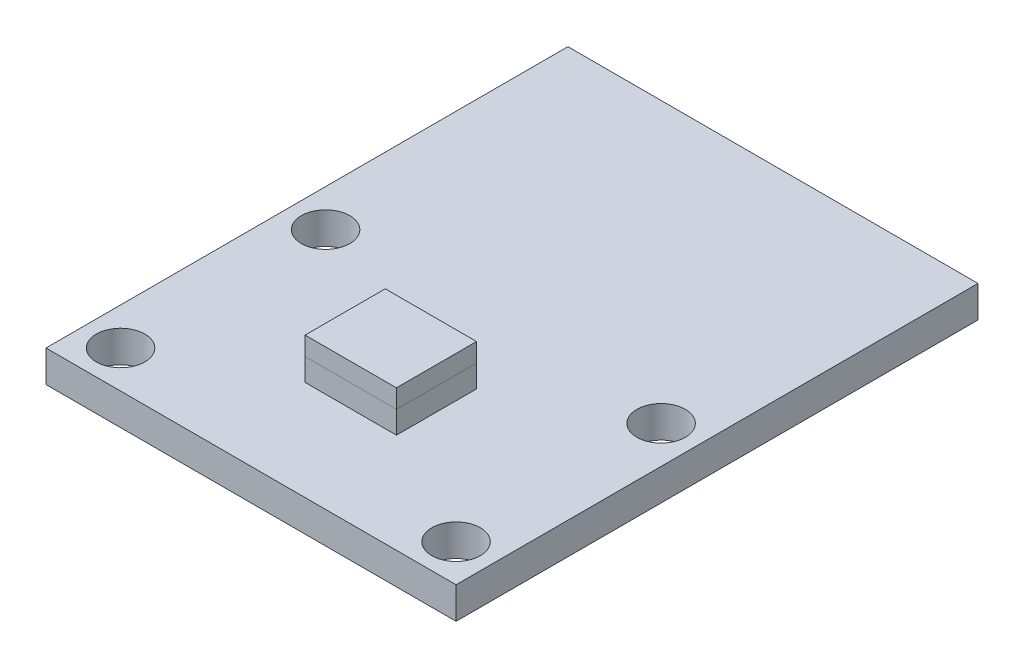
ISO-10303-21;
HEADER;
FILE_DESCRIPTION(('STEP AP214'),'2;1');
FILE_NAME('part.step','',(''),(''),'','','');
FILE_SCHEMA(('AUTOMOTIVE_DESIGN { 1 0 10303 214 1 1 1 1 }'));
ENDSEC;
DATA;
#1=APPLICATION_CONTEXT('core data for automotive mechanical design processes');
#2=APPLICATION_PROTOCOL_DEFINITION('international standard','automotive_design',2000,#1);
#3=PRODUCT_CONTEXT('',#1,'mechanical');
#4=PRODUCT('Part','Part','',(#3));
#5=PRODUCT_RELATED_PRODUCT_CATEGORY('part','',(#4));
#6=PRODUCT_DEFINITION_FORMATION('','',#4);
#7=PRODUCT_DEFINITION_CONTEXT('part definition',#1,'design');
#8=PRODUCT_DEFINITION('design','',#6,#7);
#9=PRODUCT_DEFINITION_SHAPE('','',#8);
#10=(LENGTH_UNIT() NAMED_UNIT(*) SI_UNIT(.MILLI.,.METRE.));
#11=(NAMED_UNIT(*) PLANE_ANGLE_UNIT() SI_UNIT($,.RADIAN.));
#12=(NAMED_UNIT(*) SI_UNIT($,.STERADIAN.) SOLID_ANGLE_UNIT());
#13=UNCERTAINTY_MEASURE_WITH_UNIT(LENGTH_MEASURE(1.E-05),#10,'distance_accuracy_value','');
#14=(GEOMETRIC_REPRESENTATION_CONTEXT(3) GLOBAL_UNCERTAINTY_ASSIGNED_CONTEXT((#13)) GLOBAL_UNIT_ASSIGNED_CONTEXT((#10,
#11,#12)) REPRESENTATION_CONTEXT('',''));
#15=CARTESIAN_POINT('',(0.,0.,0.));
#16=DIRECTION('',(0.,0.,1.));
#17=DIRECTION('',(1.,0.,0.));
#18=AXIS2_PLACEMENT_3D('',#15,#16,#17);
#19=CARTESIAN_POINT('',(-2.45,3.9,2.15));
#20=DIRECTION('',(0.,0.,-1.));
#21=DIRECTION('',(-1.,0.,0.));
#22=AXIS2_PLACEMENT_3D('',#19,#20,#21);
#23=PLANE('',#22);
#24=DIRECTION('',(1.,0.,0.));
#25=VECTOR('',#24,1.);
#26=CARTESIAN_POINT('',(-2.45,2.9,2.15));
#27=LINE('',#26,#25);
#28=CARTESIAN_POINT('',(-2.45,2.9,2.15));
#29=VERTEX_POINT('',#28);
#30=CARTESIAN_POINT('',(2.45,2.9,2.15));
#31=VERTEX_POINT('',#30);
#32=EDGE_CURVE('E106',#29,#31,#27,.T.);
#33=ORIENTED_EDGE('',*,*,#32,.T.);
#34=DIRECTION('',(0.,-1.,0.));
#35=VECTOR('',#34,1.);
#36=CARTESIAN_POINT('',(2.45,3.9,2.15));
#37=LINE('',#36,#35);
#38=CARTESIAN_POINT('',(2.45,3.9,2.15));
#39=VERTEX_POINT('',#38);
#40=EDGE_CURVE('E12',#39,#31,#37,.T.);
#41=ORIENTED_EDGE('',*,*,#40,.F.);
#42=DIRECTION('',(1.,0.,0.));
#43=VECTOR('',#42,1.);
#44=CARTESIAN_POINT('',(-2.45,3.9,2.15));
#45=LINE('',#44,#43);
#46=CARTESIAN_POINT('',(-2.45,3.9,2.15));
#47=VERTEX_POINT('',#46);
#48=EDGE_CURVE('E94',#47,#39,#45,.T.);
#49=ORIENTED_EDGE('',*,*,#48,.F.);
#50=DIRECTION('',(0.,-1.,0.));
#51=VECTOR('',#50,1.);
#52=CARTESIAN_POINT('',(-2.45,3.9,2.15));
#53=LINE('',#52,#51);
#54=EDGE_CURVE('E102',#47,#29,#53,.T.);
#55=ORIENTED_EDGE('',*,*,#54,.T.);
#56=EDGE_LOOP('',(#33,#41,#49,#55));
#57=FACE_BOUND('',#56,.T.);
#58=ADVANCED_FACE('F43',(#57),#23,.F.);
#59=CARTESIAN_POINT('',(2.45,3.9,2.15));
#60=DIRECTION('',(-1.,0.,0.));
#61=DIRECTION('',(0.,0.,1.));
#62=AXIS2_PLACEMENT_3D('',#59,#60,#61);
#63=PLANE('',#62);
#64=DIRECTION('',(0.,0.,-1.));
#65=VECTOR('',#64,1.);
#66=CARTESIAN_POINT('',(2.45,2.9,2.15));
#67=LINE('',#66,#65);
#68=CARTESIAN_POINT('',(2.45,2.9,-2.15));
#69=VERTEX_POINT('',#68);
#70=EDGE_CURVE('E98',#31,#69,#67,.T.);
#71=ORIENTED_EDGE('',*,*,#70,.T.);
#72=DIRECTION('',(0.,-1.,0.));
#73=VECTOR('',#72,1.);
#74=CARTESIAN_POINT('',(2.45,3.9,-2.15));
#75=LINE('',#74,#73);
#76=CARTESIAN_POINT('',(2.45,3.9,-2.15));
#77=VERTEX_POINT('',#76);
#78=EDGE_CURVE('E51',#77,#69,#75,.T.);
#79=ORIENTED_EDGE('',*,*,#78,.F.);
#80=DIRECTION('',(0.,0.,-1.));
#81=VECTOR('',#80,1.);
#82=CARTESIAN_POINT('',(2.45,3.9,2.15));
#83=LINE('',#82,#81);
#84=EDGE_CURVE('E89',#39,#77,#83,.T.);
#85=ORIENTED_EDGE('',*,*,#84,.F.);
#86=ORIENTED_EDGE('',*,*,#40,.T.);
#87=EDGE_LOOP('',(#71,#79,#85,#86));
#88=FACE_BOUND('',#87,.T.);
#89=ADVANCED_FACE('F97',(#88),#63,.F.);
#90=CARTESIAN_POINT('',(2.45,3.9,-2.15));
#91=DIRECTION('',(0.,0.,1.));
#92=DIRECTION('',(1.,0.,0.));
#93=AXIS2_PLACEMENT_3D('',#90,#91,#92);
#94=PLANE('',#93);
#95=DIRECTION('',(-1.,0.,0.));
#96=VECTOR('',#95,1.);
#97=CARTESIAN_POINT('',(2.45,2.9,-2.15));
#98=LINE('',#97,#96);
#99=CARTESIAN_POINT('',(-2.45,2.9,-2.15));
#100=VERTEX_POINT('',#99);
#101=EDGE_CURVE('E76',#69,#100,#98,.T.);
#102=ORIENTED_EDGE('',*,*,#101,.T.);
#103=DIRECTION('',(0.,-1.,0.));
#104=VECTOR('',#103,1.);
#105=CARTESIAN_POINT('',(-2.45,3.9,-2.15));
#106=LINE('',#105,#104);
#107=CARTESIAN_POINT('',(-2.45,3.9,-2.15));
#108=VERTEX_POINT('',#107);
#109=EDGE_CURVE('E99',#108,#100,#106,.T.);
#110=ORIENTED_EDGE('',*,*,#109,.F.);
#111=DIRECTION('',(-1.,0.,0.));
#112=VECTOR('',#111,1.);
#113=CARTESIAN_POINT('',(2.45,3.9,-2.15));
#114=LINE('',#113,#112);
#115=EDGE_CURVE('E92',#77,#108,#114,.T.);
#116=ORIENTED_EDGE('',*,*,#115,.F.);
#117=ORIENTED_EDGE('',*,*,#78,.T.);
#118=EDGE_LOOP('',(#102,#110,#116,#117));
#119=FACE_BOUND('',#118,.T.);
#120=ADVANCED_FACE('F100',(#119),#94,.F.);
#121=CARTESIAN_POINT('',(-2.45,3.9,-2.15));
#122=DIRECTION('',(1.,0.,0.));
#123=DIRECTION('',(0.,0.,-1.));
#124=AXIS2_PLACEMENT_3D('',#121,#122,#123);
#125=PLANE('',#124);
#126=DIRECTION('',(0.,0.,1.));
#127=VECTOR('',#126,1.);
#128=CARTESIAN_POINT('',(-2.45,2.9,-2.15));
#129=LINE('',#128,#127);
#130=EDGE_CURVE('E82',#100,#29,#129,.T.);
#131=ORIENTED_EDGE('',*,*,#130,.T.);
#132=ORIENTED_EDGE('',*,*,#54,.F.);
#133=DIRECTION('',(0.,0.,1.));
#134=VECTOR('',#133,1.);
#135=CARTESIAN_POINT('',(-2.45,3.9,-2.15));
#136=LINE('',#135,#134);
#137=EDGE_CURVE('E59',#108,#47,#136,.T.);
#138=ORIENTED_EDGE('',*,*,#137,.F.);
#139=ORIENTED_EDGE('',*,*,#109,.T.);
#140=EDGE_LOOP('',(#131,#132,#138,#139));
#141=FACE_BOUND('',#140,.T.);
#142=ADVANCED_FACE('F113',(#141),#125,.F.);
#143=CARTESIAN_POINT('',(0.,3.9,0.));
#144=DIRECTION('',(0.,1.,0.));
#145=DIRECTION('',(0.,0.,1.));
#146=AXIS2_PLACEMENT_3D('',#143,#144,#145);
#147=PLANE('',#146);
#148=ORIENTED_EDGE('',*,*,#48,.T.);
#149=ORIENTED_EDGE('',*,*,#84,.T.);
#150=ORIENTED_EDGE('',*,*,#115,.T.);
#151=ORIENTED_EDGE('',*,*,#137,.T.);
#152=EDGE_LOOP('',(#148,#149,#150,#151));
#153=FACE_BOUND('',#152,.T.);
#154=ADVANCED_FACE('F90',(#153),#147,.T.);
#155=CARTESIAN_POINT('',(0.,2.9,0.));
#156=DIRECTION('',(0.,1.,0.));
#157=DIRECTION('',(0.,0.,1.));
#158=AXIS2_PLACEMENT_3D('',#155,#156,#157);
#159=PLANE('',#158);
#160=ORIENTED_EDGE('',*,*,#32,.F.);
#161=ORIENTED_EDGE('',*,*,#130,.F.);
#162=ORIENTED_EDGE('',*,*,#101,.F.);
#163=ORIENTED_EDGE('',*,*,#70,.F.);
#164=EDGE_LOOP('',(#160,#161,#162,#163));
#165=FACE_BOUND('',#164,.T.);
#166=ADVANCED_FACE('F116',(#165),#159,.F.);
#167=CLOSED_SHELL('',(#58,#89,#120,#142,#154,#166));
#168=MANIFOLD_SOLID_BREP('B2',#167);
#169=CARTESIAN_POINT('',(0.,1.7,0.));
#170=DIRECTION('',(0.,1.,0.));
#171=DIRECTION('',(0.,0.,1.));
#172=AXIS2_PLACEMENT_3D('',#169,#170,#171);
#173=PLANE('',#172);
#174=CARTESIAN_POINT('',(9.,1.7,-5.5));
#175=DIRECTION('',(0.,1.,0.));
#176=DIRECTION('',(0.,0.,1.));
#177=AXIS2_PLACEMENT_3D('',#174,#175,#176);
#178=CIRCLE('',#177,1.3);
#179=CARTESIAN_POINT('',(9.,1.7,-4.2));
#180=VERTEX_POINT('',#179);
#181=EDGE_CURVE('E277',#180,#180,#178,.T.);
#182=ORIENTED_EDGE('',*,*,#181,.F.);
#183=EDGE_LOOP('',(#182));
#184=FACE_BOUND('',#183,.T.);
#185=CARTESIAN_POINT('',(-9.,1.7,5.5));
#186=DIRECTION('',(0.,1.,0.));
#187=DIRECTION('',(0.,0.,1.));
#188=AXIS2_PLACEMENT_3D('',#185,#186,#187);
#189=CIRCLE('',#188,1.3);
#190=CARTESIAN_POINT('',(-9.,1.7,6.8));
#191=VERTEX_POINT('',#190);
#192=EDGE_CURVE('E289',#191,#191,#189,.T.);
#193=ORIENTED_EDGE('',*,*,#192,.F.);
#194=EDGE_LOOP('',(#193));
#195=FACE_BOUND('',#194,.T.);
#196=DIRECTION('',(0.,0.,1.));
#197=VECTOR('',#196,1.);
#198=CARTESIAN_POINT('',(-11.,1.7,-20.5));
#199=LINE('',#198,#197);
#200=CARTESIAN_POINT('',(-11.,1.7,-20.5));
#201=VERTEX_POINT('',#200);
#202=CARTESIAN_POINT('',(-11.,1.7,7.49999999999998));
#203=VERTEX_POINT('',#202);
#204=EDGE_CURVE('E295',#201,#203,#199,.T.);
#205=ORIENTED_EDGE('',*,*,#204,.T.);
#206=DIRECTION('',(1.,0.,0.));
#207=VECTOR('',#206,1.);
#208=CARTESIAN_POINT('',(-11.,1.7,7.49999999999998));
#209=LINE('',#208,#207);
#210=CARTESIAN_POINT('',(11.,1.7,7.49999999999998));
#211=VERTEX_POINT('',#210);
#212=EDGE_CURVE('E219',#203,#211,#209,.T.);
#213=ORIENTED_EDGE('',*,*,#212,.T.);
#214=DIRECTION('',(0.,0.,-1.));
#215=VECTOR('',#214,1.);
#216=CARTESIAN_POINT('',(11.,1.7,-20.5));
#217=LINE('',#216,#215);
#218=CARTESIAN_POINT('',(11.,1.7,-20.5));
#219=VERTEX_POINT('',#218);
#220=EDGE_CURVE('E298',#211,#219,#217,.T.);
#221=ORIENTED_EDGE('',*,*,#220,.T.);
#222=DIRECTION('',(-1.,0.,0.));
#223=VECTOR('',#222,1.);
#224=CARTESIAN_POINT('',(-11.,1.7,-20.5));
#225=LINE('',#224,#223);
#226=EDGE_CURVE('E191',#219,#201,#225,.T.);
#227=ORIENTED_EDGE('',*,*,#226,.T.);
#228=EDGE_LOOP('',(#205,#213,#221,#227));
#229=FACE_BOUND('',#228,.T.);
#230=CARTESIAN_POINT('',(9.,1.7,5.5));
#231=DIRECTION('',(0.,1.,0.));
#232=DIRECTION('',(0.,0.,1.));
#233=AXIS2_PLACEMENT_3D('',#230,#231,#232);
#234=CIRCLE('',#233,1.3);
#235=CARTESIAN_POINT('',(9.,1.7,6.8));
#236=VERTEX_POINT('',#235);
#237=EDGE_CURVE('E283',#236,#236,#234,.T.);
#238=ORIENTED_EDGE('',*,*,#237,.F.);
#239=EDGE_LOOP('',(#238));
#240=FACE_BOUND('',#239,.T.);
#241=CARTESIAN_POINT('',(-9.,1.7,-5.5));
#242=DIRECTION('',(0.,1.,0.));
#243=DIRECTION('',(0.,0.,1.));
#244=AXIS2_PLACEMENT_3D('',#241,#242,#243);
#245=CIRCLE('',#244,1.3);
#246=CARTESIAN_POINT('',(-9.,1.7,-4.2));
#247=VERTEX_POINT('',#246);
#248=EDGE_CURVE('E269',#247,#247,#245,.T.);
#249=ORIENTED_EDGE('',*,*,#248,.F.);
#250=EDGE_LOOP('',(#249));
#251=FACE_BOUND('',#250,.T.);
#252=DIRECTION('',(-1.,0.,0.));
#253=VECTOR('',#252,1.);
#254=CARTESIAN_POINT('',(-2.45,1.7,-2.15));
#255=LINE('',#254,#253);
#256=CARTESIAN_POINT('',(2.45,1.7,-2.15));
#257=VERTEX_POINT('',#256);
#258=CARTESIAN_POINT('',(-2.45,1.7,-2.15));
#259=VERTEX_POINT('',#258);
#260=EDGE_CURVE('E465',#257,#259,#255,.T.);
#261=ORIENTED_EDGE('',*,*,#260,.F.);
#262=DIRECTION('',(0.,0.,-1.));
#263=VECTOR('',#262,1.);
#264=CARTESIAN_POINT('',(2.45,1.7,2.15));
#265=LINE('',#264,#263);
#266=CARTESIAN_POINT('',(2.45,1.7,2.15));
#267=VERTEX_POINT('',#266);
#268=EDGE_CURVE('E264',#267,#257,#265,.T.);
#269=ORIENTED_EDGE('',*,*,#268,.F.);
#270=DIRECTION('',(1.,0.,0.));
#271=VECTOR('',#270,1.);
#272=CARTESIAN_POINT('',(-2.45,1.7,2.15));
#273=LINE('',#272,#271);
#274=CARTESIAN_POINT('',(-2.45,1.7,2.15));
#275=VERTEX_POINT('',#274);
#276=EDGE_CURVE('E260',#275,#267,#273,.T.);
#277=ORIENTED_EDGE('',*,*,#276,.F.);
#278=DIRECTION('',(0.,0.,1.));
#279=VECTOR('',#278,1.);
#280=CARTESIAN_POINT('',(-2.45,1.7,2.15));
#281=LINE('',#280,#279);
#282=EDGE_CURVE('E462',#259,#275,#281,.T.);
#283=ORIENTED_EDGE('',*,*,#282,.F.);
#284=EDGE_LOOP('',(#261,#269,#277,#283));
#285=FACE_BOUND('',#284,.T.);
#286=ADVANCED_FACE('F167',(#184,#195,#229,#240,#251,#285),#173,.T.);
#287=CARTESIAN_POINT('',(0.,0.,0.));
#288=DIRECTION('',(0.,1.,0.));
#289=DIRECTION('',(0.,0.,1.));
#290=AXIS2_PLACEMENT_3D('',#287,#288,#289);
#291=PLANE('',#290);
#292=DIRECTION('',(0.,0.,1.));
#293=VECTOR('',#292,1.);
#294=CARTESIAN_POINT('',(-11.,0.,-20.5));
#295=LINE('',#294,#293);
#296=CARTESIAN_POINT('',(-11.,0.,-20.5));
#297=VERTEX_POINT('',#296);
#298=CARTESIAN_POINT('',(-11.,0.,7.49999999999998));
#299=VERTEX_POINT('',#298);
#300=EDGE_CURVE('E292',#297,#299,#295,.T.);
#301=ORIENTED_EDGE('',*,*,#300,.F.);
#302=DIRECTION('',(-1.,0.,0.));
#303=VECTOR('',#302,1.);
#304=CARTESIAN_POINT('',(-11.,0.,-20.5));
#305=LINE('',#304,#303);
#306=CARTESIAN_POINT('',(11.,0.,-20.5));
#307=VERTEX_POINT('',#306);
#308=EDGE_CURVE('E212',#307,#297,#305,.T.);
#309=ORIENTED_EDGE('',*,*,#308,.F.);
#310=DIRECTION('',(0.,0.,-1.));
#311=VECTOR('',#310,1.);
#312=CARTESIAN_POINT('',(11.,0.,-20.5));
#313=LINE('',#312,#311);
#314=CARTESIAN_POINT('',(11.,0.,7.49999999999998));
#315=VERTEX_POINT('',#314);
#316=EDGE_CURVE('E306',#315,#307,#313,.T.);
#317=ORIENTED_EDGE('',*,*,#316,.F.);
#318=DIRECTION('',(1.,0.,0.));
#319=VECTOR('',#318,1.);
#320=CARTESIAN_POINT('',(-11.,0.,7.49999999999998));
#321=LINE('',#320,#319);
#322=EDGE_CURVE('E304',#299,#315,#321,.T.);
#323=ORIENTED_EDGE('',*,*,#322,.F.);
#324=EDGE_LOOP('',(#301,#309,#317,#323));
#325=FACE_BOUND('',#324,.T.);
#326=CARTESIAN_POINT('',(-9.,0.,5.5));
#327=DIRECTION('',(0.,1.,0.));
#328=DIRECTION('',(0.,0.,1.));
#329=AXIS2_PLACEMENT_3D('',#326,#327,#328);
#330=CIRCLE('',#329,1.3);
#331=CARTESIAN_POINT('',(-9.,0.,6.8));
#332=VERTEX_POINT('',#331);
#333=EDGE_CURVE('E286',#332,#332,#330,.T.);
#334=ORIENTED_EDGE('',*,*,#333,.T.);
#335=EDGE_LOOP('',(#334));
#336=FACE_BOUND('',#335,.T.);
#337=CARTESIAN_POINT('',(9.,0.,5.5));
#338=DIRECTION('',(0.,1.,0.));
#339=DIRECTION('',(0.,0.,1.));
#340=AXIS2_PLACEMENT_3D('',#337,#338,#339);
#341=CIRCLE('',#340,1.3);
#342=CARTESIAN_POINT('',(9.,0.,6.8));
#343=VERTEX_POINT('',#342);
#344=EDGE_CURVE('E280',#343,#343,#341,.T.);
#345=ORIENTED_EDGE('',*,*,#344,.T.);
#346=EDGE_LOOP('',(#345));
#347=FACE_BOUND('',#346,.T.);
#348=CARTESIAN_POINT('',(9.,0.,-5.5));
#349=DIRECTION('',(0.,1.,0.));
#350=DIRECTION('',(0.,0.,1.));
#351=AXIS2_PLACEMENT_3D('',#348,#349,#350);
#352=CIRCLE('',#351,1.3);
#353=CARTESIAN_POINT('',(9.,0.,-4.2));
#354=VERTEX_POINT('',#353);
#355=EDGE_CURVE('E275',#354,#354,#352,.T.);
#356=ORIENTED_EDGE('',*,*,#355,.T.);
#357=EDGE_LOOP('',(#356));
#358=FACE_BOUND('',#357,.T.);
#359=CARTESIAN_POINT('',(-9.,0.,-5.5));
#360=DIRECTION('',(0.,1.,0.));
#361=DIRECTION('',(0.,0.,1.));
#362=AXIS2_PLACEMENT_3D('',#359,#360,#361);
#363=CIRCLE('',#362,1.3);
#364=CARTESIAN_POINT('',(-9.,0.,-4.2));
#365=VERTEX_POINT('',#364);
#366=EDGE_CURVE('E266',#365,#365,#363,.T.);
#367=ORIENTED_EDGE('',*,*,#366,.T.);
#368=EDGE_LOOP('',(#367));
#369=FACE_BOUND('',#368,.T.);
#370=ADVANCED_FACE('F319',(#325,#336,#347,#358,#369),#291,.F.);
#371=CARTESIAN_POINT('',(-11.,1.7,-20.5));
#372=DIRECTION('',(1.,0.,0.));
#373=DIRECTION('',(0.,0.,-1.));
#374=AXIS2_PLACEMENT_3D('',#371,#372,#373);
#375=PLANE('',#374);
#376=ORIENTED_EDGE('',*,*,#300,.T.);
#377=DIRECTION('',(0.,-1.,0.));
#378=VECTOR('',#377,1.);
#379=CARTESIAN_POINT('',(-11.,1.7,7.49999999999998));
#380=LINE('',#379,#378);
#381=EDGE_CURVE('E41',#203,#299,#380,.T.);
#382=ORIENTED_EDGE('',*,*,#381,.F.);
#383=ORIENTED_EDGE('',*,*,#204,.F.);
#384=DIRECTION('',(0.,-1.,0.));
#385=VECTOR('',#384,1.);
#386=CARTESIAN_POINT('',(-11.,1.7,-20.5));
#387=LINE('',#386,#385);
#388=EDGE_CURVE('E301',#201,#297,#387,.T.);
#389=ORIENTED_EDGE('',*,*,#388,.T.);
#390=EDGE_LOOP('',(#376,#382,#383,#389));
#391=FACE_BOUND('',#390,.T.);
#392=ADVANCED_FACE('F169',(#391),#375,.F.);
#393=CARTESIAN_POINT('',(-11.,1.7,7.49999999999998));
#394=DIRECTION('',(0.,0.,-1.));
#395=DIRECTION('',(-1.,0.,0.));
#396=AXIS2_PLACEMENT_3D('',#393,#394,#395);
#397=PLANE('',#396);
#398=ORIENTED_EDGE('',*,*,#322,.T.);
#399=DIRECTION('',(0.,-1.,0.));
#400=VECTOR('',#399,1.);
#401=CARTESIAN_POINT('',(11.,1.7,7.49999999999998));
#402=LINE('',#401,#400);
#403=EDGE_CURVE('E175',#211,#315,#402,.T.);
#404=ORIENTED_EDGE('',*,*,#403,.F.);
#405=ORIENTED_EDGE('',*,*,#212,.F.);
#406=ORIENTED_EDGE('',*,*,#381,.T.);
#407=EDGE_LOOP('',(#398,#404,#405,#406));
#408=FACE_BOUND('',#407,.T.);
#409=ADVANCED_FACE('F335',(#408),#397,.F.);
#410=CARTESIAN_POINT('',(11.,1.7,-20.5));
#411=DIRECTION('',(-1.,0.,0.));
#412=DIRECTION('',(0.,0.,1.));
#413=AXIS2_PLACEMENT_3D('',#410,#411,#412);
#414=PLANE('',#413);
#415=ORIENTED_EDGE('',*,*,#316,.T.);
#416=DIRECTION('',(0.,-1.,0.));
#417=VECTOR('',#416,1.);
#418=CARTESIAN_POINT('',(11.,1.7,-20.5));
#419=LINE('',#418,#417);
#420=EDGE_CURVE('E310',#219,#307,#419,.T.);
#421=ORIENTED_EDGE('',*,*,#420,.F.);
#422=ORIENTED_EDGE('',*,*,#220,.F.);
#423=ORIENTED_EDGE('',*,*,#403,.T.);
#424=EDGE_LOOP('',(#415,#421,#422,#423));
#425=FACE_BOUND('',#424,.T.);
#426=ADVANCED_FACE('F315',(#425),#414,.F.);
#427=CARTESIAN_POINT('',(-11.,1.7,-20.5));
#428=DIRECTION('',(0.,0.,1.));
#429=DIRECTION('',(1.,0.,0.));
#430=AXIS2_PLACEMENT_3D('',#427,#428,#429);
#431=PLANE('',#430);
#432=ORIENTED_EDGE('',*,*,#308,.T.);
#433=ORIENTED_EDGE('',*,*,#388,.F.);
#434=ORIENTED_EDGE('',*,*,#226,.F.);
#435=ORIENTED_EDGE('',*,*,#420,.T.);
#436=EDGE_LOOP('',(#432,#433,#434,#435));
#437=FACE_BOUND('',#436,.T.);
#438=ADVANCED_FACE('F324',(#437),#431,.F.);
#439=CARTESIAN_POINT('',(-9.,1.7,5.5));
#440=DIRECTION('',(0.,-1.,0.));
#441=DIRECTION('',(0.,0.,-1.));
#442=AXIS2_PLACEMENT_3D('',#439,#440,#441);
#443=CYLINDRICAL_SURFACE('',#442,1.3);
#444=ORIENTED_EDGE('',*,*,#192,.T.);
#445=EDGE_LOOP('',(#444));
#446=FACE_BOUND('',#445,.T.);
#447=ORIENTED_EDGE('',*,*,#333,.F.);
#448=EDGE_LOOP('',(#447));
#449=FACE_BOUND('',#448,.T.);
#450=ADVANCED_FACE('F326',(#446,#449),#443,.F.);
#451=CARTESIAN_POINT('',(9.,1.7,5.5));
#452=DIRECTION('',(0.,-1.,0.));
#453=DIRECTION('',(0.,0.,-1.));
#454=AXIS2_PLACEMENT_3D('',#451,#452,#453);
#455=CYLINDRICAL_SURFACE('',#454,1.3);
#456=ORIENTED_EDGE('',*,*,#237,.T.);
#457=EDGE_LOOP('',(#456));
#458=FACE_BOUND('',#457,.T.);
#459=ORIENTED_EDGE('',*,*,#344,.F.);
#460=EDGE_LOOP('',(#459));
#461=FACE_BOUND('',#460,.T.);
#462=ADVANCED_FACE('F332',(#458,#461),#455,.F.);
#463=CARTESIAN_POINT('',(9.,1.7,-5.5));
#464=DIRECTION('',(0.,-1.,0.));
#465=DIRECTION('',(0.,0.,-1.));
#466=AXIS2_PLACEMENT_3D('',#463,#464,#465);
#467=CYLINDRICAL_SURFACE('',#466,1.3);
#468=ORIENTED_EDGE('',*,*,#181,.T.);
#469=EDGE_LOOP('',(#468));
#470=FACE_BOUND('',#469,.T.);
#471=ORIENTED_EDGE('',*,*,#355,.F.);
#472=EDGE_LOOP('',(#471));
#473=FACE_BOUND('',#472,.T.);
#474=ADVANCED_FACE('F349',(#470,#473),#467,.F.);
#475=CARTESIAN_POINT('',(-9.,1.7,-5.5));
#476=DIRECTION('',(0.,-1.,0.));
#477=DIRECTION('',(0.,0.,-1.));
#478=AXIS2_PLACEMENT_3D('',#475,#476,#477);
#479=CYLINDRICAL_SURFACE('',#478,1.3);
#480=ORIENTED_EDGE('',*,*,#248,.T.);
#481=EDGE_LOOP('',(#480));
#482=FACE_BOUND('',#481,.T.);
#483=ORIENTED_EDGE('',*,*,#366,.F.);
#484=EDGE_LOOP('',(#483));
#485=FACE_BOUND('',#484,.T.);
#486=ADVANCED_FACE('F353',(#482,#485),#479,.F.);
#487=CARTESIAN_POINT('',(2.45,2.9,2.15));
#488=DIRECTION('',(-1.,0.,0.));
#489=DIRECTION('',(0.,0.,1.));
#490=AXIS2_PLACEMENT_3D('',#487,#488,#489);
#491=PLANE('',#490);
#492=ORIENTED_EDGE('',*,*,#268,.T.);
#493=DIRECTION('',(0.,-1.,0.));
#494=VECTOR('',#493,1.);
#495=CARTESIAN_POINT('',(2.45,2.9,-2.15));
#496=LINE('',#495,#494);
#497=CARTESIAN_POINT('',(2.45,2.9,-2.15));
#498=VERTEX_POINT('',#497);
#499=EDGE_CURVE('E245',#498,#257,#496,.T.);
#500=ORIENTED_EDGE('',*,*,#499,.F.);
#501=DIRECTION('',(0.,0.,-1.));
#502=VECTOR('',#501,1.);
#503=CARTESIAN_POINT('',(2.45,2.9,2.15));
#504=LINE('',#503,#502);
#505=CARTESIAN_POINT('',(2.45,2.9,2.15));
#506=VERTEX_POINT('',#505);
#507=EDGE_CURVE('E252',#506,#498,#504,.T.);
#508=ORIENTED_EDGE('',*,*,#507,.F.);
#509=DIRECTION('',(0.,-1.,0.));
#510=VECTOR('',#509,1.);
#511=CARTESIAN_POINT('',(2.45,2.9,2.15));
#512=LINE('',#511,#510);
#513=EDGE_CURVE('E459',#506,#267,#512,.T.);
#514=ORIENTED_EDGE('',*,*,#513,.T.);
#515=EDGE_LOOP('',(#492,#500,#508,#514));
#516=FACE_BOUND('',#515,.T.);
#517=ADVANCED_FACE('F262',(#516),#491,.F.);
#518=CARTESIAN_POINT('',(-2.45,2.9,-2.15));
#519=DIRECTION('',(0.,0.,1.));
#520=DIRECTION('',(1.,0.,0.));
#521=AXIS2_PLACEMENT_3D('',#518,#519,#520);
#522=PLANE('',#521);
#523=ORIENTED_EDGE('',*,*,#260,.T.);
#524=DIRECTION('',(0.,-1.,0.));
#525=VECTOR('',#524,1.);
#526=CARTESIAN_POINT('',(-2.45,2.9,-2.15));
#527=LINE('',#526,#525);
#528=CARTESIAN_POINT('',(-2.45,2.9,-2.15));
#529=VERTEX_POINT('',#528);
#530=EDGE_CURVE('E248',#529,#259,#527,.T.);
#531=ORIENTED_EDGE('',*,*,#530,.F.);
#532=DIRECTION('',(-1.,0.,0.));
#533=VECTOR('',#532,1.);
#534=CARTESIAN_POINT('',(-2.45,2.9,-2.15));
#535=LINE('',#534,#533);
#536=EDGE_CURVE('E241',#498,#529,#535,.T.);
#537=ORIENTED_EDGE('',*,*,#536,.F.);
#538=ORIENTED_EDGE('',*,*,#499,.T.);
#539=EDGE_LOOP('',(#523,#531,#537,#538));
#540=FACE_BOUND('',#539,.T.);
#541=ADVANCED_FACE('F243',(#540),#522,.F.);
#542=CARTESIAN_POINT('',(-2.45,2.9,2.15));
#543=DIRECTION('',(1.,0.,0.));
#544=DIRECTION('',(0.,0.,-1.));
#545=AXIS2_PLACEMENT_3D('',#542,#543,#544);
#546=PLANE('',#545);
#547=ORIENTED_EDGE('',*,*,#282,.T.);
#548=DIRECTION('',(0.,-1.,0.));
#549=VECTOR('',#548,1.);
#550=CARTESIAN_POINT('',(-2.45,2.9,2.15));
#551=LINE('',#550,#549);
#552=CARTESIAN_POINT('',(-2.45,2.9,2.15));
#553=VERTEX_POINT('',#552);
#554=EDGE_CURVE('E182',#553,#275,#551,.T.);
#555=ORIENTED_EDGE('',*,*,#554,.F.);
#556=DIRECTION('',(0.,0.,1.));
#557=VECTOR('',#556,1.);
#558=CARTESIAN_POINT('',(-2.45,2.9,2.15));
#559=LINE('',#558,#557);
#560=EDGE_CURVE('E251',#529,#553,#559,.T.);
#561=ORIENTED_EDGE('',*,*,#560,.F.);
#562=ORIENTED_EDGE('',*,*,#530,.T.);
#563=EDGE_LOOP('',(#547,#555,#561,#562));
#564=FACE_BOUND('',#563,.T.);
#565=ADVANCED_FACE('F362',(#564),#546,.F.);
#566=CARTESIAN_POINT('',(-2.45,2.9,2.15));
#567=DIRECTION('',(0.,0.,-1.));
#568=DIRECTION('',(-1.,0.,0.));
#569=AXIS2_PLACEMENT_3D('',#566,#567,#568);
#570=PLANE('',#569);
#571=ORIENTED_EDGE('',*,*,#276,.T.);
#572=ORIENTED_EDGE('',*,*,#513,.F.);
#573=DIRECTION('',(1.,0.,0.));
#574=VECTOR('',#573,1.);
#575=CARTESIAN_POINT('',(-2.45,2.9,2.15));
#576=LINE('',#575,#574);
#577=EDGE_CURVE('E256',#553,#506,#576,.T.);
#578=ORIENTED_EDGE('',*,*,#577,.F.);
#579=ORIENTED_EDGE('',*,*,#554,.T.);
#580=EDGE_LOOP('',(#571,#572,#578,#579));
#581=FACE_BOUND('',#580,.T.);
#582=ADVANCED_FACE('F365',(#581),#570,.F.);
#583=CARTESIAN_POINT('',(0.,2.9,0.));
#584=DIRECTION('',(0.,-1.,0.));
#585=DIRECTION('',(0.,0.,-1.));
#586=AXIS2_PLACEMENT_3D('',#583,#584,#585);
#587=PLANE('',#586);
#588=ORIENTED_EDGE('',*,*,#507,.T.);
#589=ORIENTED_EDGE('',*,*,#536,.T.);
#590=ORIENTED_EDGE('',*,*,#560,.T.);
#591=ORIENTED_EDGE('',*,*,#577,.T.);
#592=EDGE_LOOP('',(#588,#589,#590,#591));
#593=FACE_BOUND('',#592,.T.);
#594=ADVANCED_FACE('F255',(#593),#587,.F.);
#595=CLOSED_SHELL('',(#286,#370,#392,#409,#426,#438,#450,#462,#474,#486,#517,#541,#565,#582,#594));
#596=MANIFOLD_SOLID_BREP('B6',#595);
#597=ADVANCED_BREP_SHAPE_REPRESENTATION('',(#18,#168,#596),#14);
#598=SHAPE_DEFINITION_REPRESENTATION(#9,#597);
ENDSEC;
END-ISO-10303-21;
